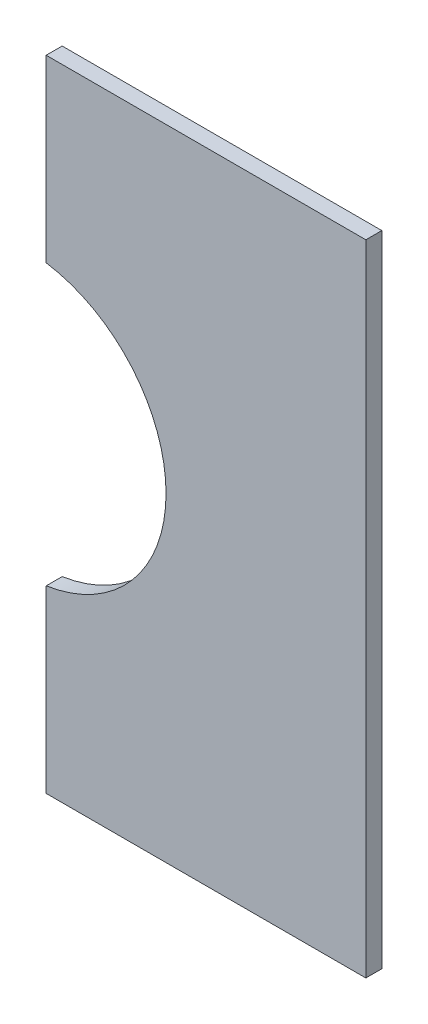
ISO-10303-21;
HEADER;
FILE_DESCRIPTION(('STEP AP214'),'2;1');
FILE_NAME('part.step','',(''),(''),'','','');
FILE_SCHEMA(('AUTOMOTIVE_DESIGN { 1 0 10303 214 1 1 1 1 }'));
ENDSEC;
DATA;
#1=APPLICATION_CONTEXT('core data for automotive mechanical design processes');
#2=APPLICATION_PROTOCOL_DEFINITION('international standard','automotive_design',2000,#1);
#3=PRODUCT_CONTEXT('',#1,'mechanical');
#4=PRODUCT('Part','Part','',(#3));
#5=PRODUCT_RELATED_PRODUCT_CATEGORY('part','',(#4));
#6=PRODUCT_DEFINITION_FORMATION('','',#4);
#7=PRODUCT_DEFINITION_CONTEXT('part definition',#1,'design');
#8=PRODUCT_DEFINITION('design','',#6,#7);
#9=PRODUCT_DEFINITION_SHAPE('','',#8);
#10=(LENGTH_UNIT() NAMED_UNIT(*) SI_UNIT(.MILLI.,.METRE.));
#11=(NAMED_UNIT(*) PLANE_ANGLE_UNIT() SI_UNIT($,.RADIAN.));
#12=(NAMED_UNIT(*) SI_UNIT($,.STERADIAN.) SOLID_ANGLE_UNIT());
#13=UNCERTAINTY_MEASURE_WITH_UNIT(LENGTH_MEASURE(1.E-05),#10,'distance_accuracy_value','');
#14=(GEOMETRIC_REPRESENTATION_CONTEXT(3) GLOBAL_UNCERTAINTY_ASSIGNED_CONTEXT((#13)) GLOBAL_UNIT_ASSIGNED_CONTEXT((#10,
#11,#12)) REPRESENTATION_CONTEXT('',''));
#15=CARTESIAN_POINT('',(0.,0.,0.));
#16=DIRECTION('',(0.,0.,1.));
#17=DIRECTION('',(1.,0.,0.));
#18=AXIS2_PLACEMENT_3D('',#15,#16,#17);
#19=CARTESIAN_POINT('',(18.8349999999641,70.1830000001743,2.03325399955297));
#20=DIRECTION('',(0.,0.,-1.));
#21=DIRECTION('',(-1.,0.,0.));
#22=AXIS2_PLACEMENT_3D('',#19,#20,#21);
#23=PLANE('',#22);
#24=DIRECTION('',(-2.05103550980011E-10,-1.,0.));
#25=VECTOR('',#24,1.);
#26=CARTESIAN_POINT('',(19.234999999918,69.9580000000923,2.03325399955297));
#27=LINE('',#26,#25);
#28=CARTESIAN_POINT('',(19.234999999918,69.9580000000923,2.03325399955297));
#29=VERTEX_POINT('',#28);
#30=CARTESIAN_POINT('',(19.235000000082,70.7580000001128,2.03325399955297));
#31=VERTEX_POINT('',#30);
#32=EDGE_CURVE('E106',#29,#31,#27,.F.);
#33=ORIENTED_EDGE('',*,*,#32,.T.);
#34=DIRECTION('',(1.,-2.05103550980011E-10,0.));
#35=VECTOR('',#34,1.);
#36=CARTESIAN_POINT('',(19.235000000082,70.7580000000923,2.03325399955297));
#37=LINE('',#36,#35);
#38=CARTESIAN_POINT('',(18.835000000082,70.7580000001743,2.03325399955297));
#39=VERTEX_POINT('',#38);
#40=EDGE_CURVE('E122',#31,#39,#37,.F.);
#41=ORIENTED_EDGE('',*,*,#40,.T.);
#42=DIRECTION('',(2.05103550980011E-10,1.,0.));
#43=VECTOR('',#42,1.);
#44=CARTESIAN_POINT('',(18.835000000082,70.7580000001743,2.03325399955297));
#45=LINE('',#44,#43);
#46=CARTESIAN_POINT('',(18.8350000000359,70.5330000001741,2.03325399955297));
#47=VERTEX_POINT('',#46);
#48=EDGE_CURVE('E68',#39,#47,#45,.F.);
#49=ORIENTED_EDGE('',*,*,#48,.T.);
#50=CARTESIAN_POINT('',(18.807916666667,70.3580000001799,2.03325399955297));
#51=DIRECTION('',(0.,0.,1.));
#52=DIRECTION('',(1.,0.,0.));
#53=AXIS2_PLACEMENT_3D('',#50,#51,#52);
#54=CIRCLE('',#53,0.177083333333);
#55=CARTESIAN_POINT('',(18.8349999999641,70.1830000001746,2.03325399955297));
#56=VERTEX_POINT('',#55);
#57=EDGE_CURVE('E20',#47,#56,#54,.F.);
#58=ORIENTED_EDGE('',*,*,#57,.T.);
#59=DIRECTION('',(2.05103550980011E-10,1.,0.));
#60=VECTOR('',#59,1.);
#61=CARTESIAN_POINT('',(18.8349999999641,70.1830000001743,2.03325399955297));
#62=LINE('',#61,#60);
#63=CARTESIAN_POINT('',(18.834999999918,69.9580000001743,2.03325399955297));
#64=VERTEX_POINT('',#63);
#65=EDGE_CURVE('E73',#56,#64,#62,.F.);
#66=ORIENTED_EDGE('',*,*,#65,.T.);
#67=DIRECTION('',(-1.,2.05103550980011E-10,0.));
#68=VECTOR('',#67,1.);
#69=CARTESIAN_POINT('',(18.834999999918,69.9580000001743,2.03325399955297));
#70=LINE('',#69,#68);
#71=EDGE_CURVE('E81',#64,#29,#70,.F.);
#72=ORIENTED_EDGE('',*,*,#71,.T.);
#73=EDGE_LOOP('',(#33,#41,#49,#58,#66,#72));
#74=FACE_BOUND('',#73,.T.);
#75=ADVANCED_FACE('F17',(#74),#23,.F.);
#76=CARTESIAN_POINT('',(18.834999999918,69.9580000001743,2.013254));
#77=DIRECTION('',(2.05103550980011E-10,1.,0.));
#78=DIRECTION('',(-1.,2.05103550980011E-10,0.));
#79=AXIS2_PLACEMENT_3D('',#76,#77,#78);
#80=PLANE('',#79);
#81=ORIENTED_EDGE('',*,*,#71,.F.);
#82=DIRECTION('',(0.,0.,1.));
#83=VECTOR('',#82,1.);
#84=CARTESIAN_POINT('',(18.834999999918,69.9580000001743,2.013254));
#85=LINE('',#84,#83);
#86=CARTESIAN_POINT('',(18.834999999918,69.9580000001196,2.013254));
#87=VERTEX_POINT('',#86);
#88=EDGE_CURVE('E79',#64,#87,#85,.F.);
#89=ORIENTED_EDGE('',*,*,#88,.T.);
#90=DIRECTION('',(-1.,0.,0.));
#91=VECTOR('',#90,1.);
#92=CARTESIAN_POINT('',(18.8349999999641,69.9580000000923,2.013254));
#93=LINE('',#92,#91);
#94=CARTESIAN_POINT('',(19.235,69.9580000000923,2.013254));
#95=VERTEX_POINT('',#94);
#96=EDGE_CURVE('E97',#95,#87,#93,.T.);
#97=ORIENTED_EDGE('',*,*,#96,.F.);
#98=DIRECTION('',(0.,0.,1.));
#99=VECTOR('',#98,1.);
#100=CARTESIAN_POINT('',(19.234999999918,69.9580000000923,2.013254));
#101=LINE('',#100,#99);
#102=EDGE_CURVE('E103',#95,#29,#101,.T.);
#103=ORIENTED_EDGE('',*,*,#102,.T.);
#104=EDGE_LOOP('',(#81,#89,#97,#103));
#105=FACE_BOUND('',#104,.T.);
#106=ADVANCED_FACE('F167',(#105),#80,.F.);
#107=CARTESIAN_POINT('',(18.8349999999641,70.1830000001743,2.013254));
#108=DIRECTION('',(1.,-2.05103550980011E-10,0.));
#109=DIRECTION('',(2.05103550980011E-10,1.,0.));
#110=AXIS2_PLACEMENT_3D('',#107,#108,#109);
#111=PLANE('',#110);
#112=ORIENTED_EDGE('',*,*,#65,.F.);
#113=DIRECTION('',(0.,0.,1.));
#114=VECTOR('',#113,1.);
#115=CARTESIAN_POINT('',(18.8349999999641,70.1830000001746,2.013254));
#116=LINE('',#115,#114);
#117=CARTESIAN_POINT('',(18.834999999941,70.1830000001711,2.013254));
#118=VERTEX_POINT('',#117);
#119=EDGE_CURVE('E77',#56,#118,#116,.F.);
#120=ORIENTED_EDGE('',*,*,#119,.T.);
#121=DIRECTION('',(0.,1.,0.));
#122=VECTOR('',#121,1.);
#123=CARTESIAN_POINT('',(18.834999999918,70.1830000001743,2.013254));
#124=LINE('',#123,#122);
#125=EDGE_CURVE('E100',#87,#118,#124,.T.);
#126=ORIENTED_EDGE('',*,*,#125,.F.);
#127=ORIENTED_EDGE('',*,*,#88,.F.);
#128=EDGE_LOOP('',(#112,#120,#126,#127));
#129=FACE_BOUND('',#128,.T.);
#130=ADVANCED_FACE('F74',(#129),#111,.F.);
#131=CARTESIAN_POINT('',(18.807916666667,70.3580000001799,2.013254));
#132=DIRECTION('',(0.,0.,1.));
#133=DIRECTION('',(1.,0.,0.));
#134=AXIS2_PLACEMENT_3D('',#131,#132,#133);
#135=CYLINDRICAL_SURFACE('',#134,0.177083333333);
#136=DIRECTION('',(0.,0.,1.));
#137=VECTOR('',#136,1.);
#138=CARTESIAN_POINT('',(18.8350000000359,70.5330000001742,2.013254));
#139=LINE('',#138,#137);
#140=CARTESIAN_POINT('',(18.8350000000359,70.5330000001741,2.013254));
#141=VERTEX_POINT('',#140);
#142=EDGE_CURVE('E119',#47,#141,#139,.F.);
#143=ORIENTED_EDGE('',*,*,#142,.T.);
#144=CARTESIAN_POINT('',(18.807916666667,70.3580000001799,2.013254));
#145=DIRECTION('',(0.,0.,1.));
#146=DIRECTION('',(1.,0.,0.));
#147=AXIS2_PLACEMENT_3D('',#144,#145,#146);
#148=CIRCLE('',#147,0.177083333333);
#149=EDGE_CURVE('E87',#118,#141,#148,.T.);
#150=ORIENTED_EDGE('',*,*,#149,.F.);
#151=ORIENTED_EDGE('',*,*,#119,.F.);
#152=ORIENTED_EDGE('',*,*,#57,.F.);
#153=EDGE_LOOP('',(#143,#150,#151,#152));
#154=FACE_BOUND('',#153,.T.);
#155=ADVANCED_FACE('F85',(#154),#135,.F.);
#156=CARTESIAN_POINT('',(18.835000000082,70.7580000001743,2.013254));
#157=DIRECTION('',(1.,-2.05103550980011E-10,0.));
#158=DIRECTION('',(2.05103550980011E-10,1.,0.));
#159=AXIS2_PLACEMENT_3D('',#156,#157,#158);
#160=PLANE('',#159);
#161=ORIENTED_EDGE('',*,*,#48,.F.);
#162=DIRECTION('',(0.,0.,1.));
#163=VECTOR('',#162,1.);
#164=CARTESIAN_POINT('',(18.835000000082,70.7580000001743,2.013254));
#165=LINE('',#164,#163);
#166=CARTESIAN_POINT('',(18.8350000000513,70.7580000001743,2.013254));
#167=VERTEX_POINT('',#166);
#168=EDGE_CURVE('E107',#39,#167,#165,.F.);
#169=ORIENTED_EDGE('',*,*,#168,.T.);
#170=DIRECTION('',(0.,1.,0.));
#171=VECTOR('',#170,1.);
#172=CARTESIAN_POINT('',(18.8350000000359,70.1830000001743,2.013254));
#173=LINE('',#172,#171);
#174=EDGE_CURVE('E130',#141,#167,#173,.T.);
#175=ORIENTED_EDGE('',*,*,#174,.F.);
#176=ORIENTED_EDGE('',*,*,#142,.F.);
#177=EDGE_LOOP('',(#161,#169,#175,#176));
#178=FACE_BOUND('',#177,.T.);
#179=ADVANCED_FACE('F147',(#178),#160,.F.);
#180=CARTESIAN_POINT('',(19.235000000082,70.7580000000923,2.013254));
#181=DIRECTION('',(-2.05103550980011E-10,-1.,0.));
#182=DIRECTION('',(1.,-2.05103550980011E-10,0.));
#183=AXIS2_PLACEMENT_3D('',#180,#181,#182);
#184=PLANE('',#183);
#185=ORIENTED_EDGE('',*,*,#40,.F.);
#186=DIRECTION('',(0.,0.,1.));
#187=VECTOR('',#186,1.);
#188=CARTESIAN_POINT('',(19.2350000000821,70.7580000000923,2.013254));
#189=LINE('',#188,#187);
#190=CARTESIAN_POINT('',(19.235000000082,70.7580000001128,2.013254));
#191=VERTEX_POINT('',#190);
#192=EDGE_CURVE('E35',#31,#191,#189,.F.);
#193=ORIENTED_EDGE('',*,*,#192,.T.);
#194=DIRECTION('',(-1.,0.,0.));
#195=VECTOR('',#194,1.);
#196=CARTESIAN_POINT('',(18.8349999999641,70.7580000001743,2.013254));
#197=LINE('',#196,#195);
#198=EDGE_CURVE('E26',#167,#191,#197,.F.);
#199=ORIENTED_EDGE('',*,*,#198,.F.);
#200=ORIENTED_EDGE('',*,*,#168,.F.);
#201=EDGE_LOOP('',(#185,#193,#199,#200));
#202=FACE_BOUND('',#201,.T.);
#203=ADVANCED_FACE('F148',(#202),#184,.F.);
#204=CARTESIAN_POINT('',(19.234999999918,69.9580000000923,2.013254));
#205=DIRECTION('',(-1.,2.05103550980011E-10,0.));
#206=DIRECTION('',(-2.05103550980011E-10,-1.,0.));
#207=AXIS2_PLACEMENT_3D('',#204,#205,#206);
#208=PLANE('',#207);
#209=ORIENTED_EDGE('',*,*,#32,.F.);
#210=ORIENTED_EDGE('',*,*,#102,.F.);
#211=DIRECTION('',(0.,1.,0.));
#212=VECTOR('',#211,1.);
#213=CARTESIAN_POINT('',(19.235000000082,70.1830000001743,2.013254));
#214=LINE('',#213,#212);
#215=EDGE_CURVE('E11',#191,#95,#214,.F.);
#216=ORIENTED_EDGE('',*,*,#215,.F.);
#217=ORIENTED_EDGE('',*,*,#192,.F.);
#218=EDGE_LOOP('',(#209,#210,#216,#217));
#219=FACE_BOUND('',#218,.T.);
#220=ADVANCED_FACE('F151',(#219),#208,.F.);
#221=CARTESIAN_POINT('',(18.8349999999641,70.1830000001743,2.013254));
#222=DIRECTION('',(0.,0.,-1.));
#223=DIRECTION('',(-1.,0.,0.));
#224=AXIS2_PLACEMENT_3D('',#221,#222,#223);
#225=PLANE('',#224);
#226=ORIENTED_EDGE('',*,*,#198,.T.);
#227=ORIENTED_EDGE('',*,*,#215,.T.);
#228=ORIENTED_EDGE('',*,*,#96,.T.);
#229=ORIENTED_EDGE('',*,*,#125,.T.);
#230=ORIENTED_EDGE('',*,*,#149,.T.);
#231=ORIENTED_EDGE('',*,*,#174,.T.);
#232=EDGE_LOOP('',(#226,#227,#228,#229,#230,#231));
#233=FACE_BOUND('',#232,.T.);
#234=ADVANCED_FACE('F149',(#233),#225,.T.);
#235=CLOSED_SHELL('',(#75,#106,#130,#155,#179,#203,#220,#234));
#236=MANIFOLD_SOLID_BREP('B1',#235);
#237=ADVANCED_BREP_SHAPE_REPRESENTATION('',(#18,#236),#14);
#238=SHAPE_DEFINITION_REPRESENTATION(#9,#237);
ENDSEC;
END-ISO-10303-21;
